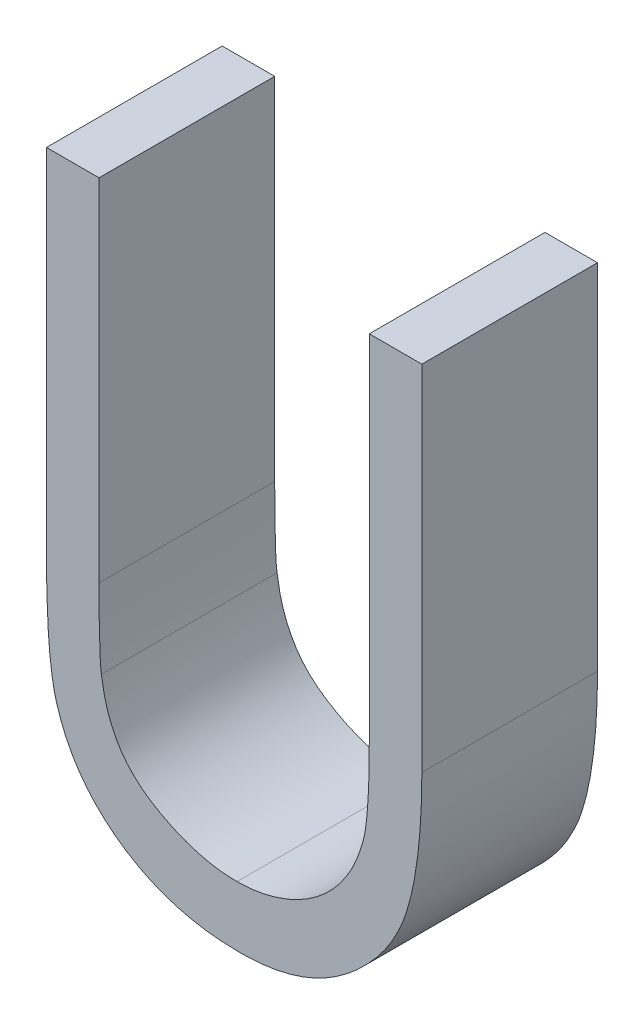
ISO-10303-21;
HEADER;
FILE_DESCRIPTION(('STEP AP214'),'2;1');
FILE_NAME('part.step','',(''),(''),'','','');
FILE_SCHEMA(('AUTOMOTIVE_DESIGN { 1 0 10303 214 1 1 1 1 }'));
ENDSEC;
DATA;
#1=APPLICATION_CONTEXT('core data for automotive mechanical design processes');
#2=APPLICATION_PROTOCOL_DEFINITION('international standard','automotive_design',2000,#1);
#3=PRODUCT_CONTEXT('',#1,'mechanical');
#4=PRODUCT('Part','Part','',(#3));
#5=PRODUCT_RELATED_PRODUCT_CATEGORY('part','',(#4));
#6=PRODUCT_DEFINITION_FORMATION('','',#4);
#7=PRODUCT_DEFINITION_CONTEXT('part definition',#1,'design');
#8=PRODUCT_DEFINITION('design','',#6,#7);
#9=PRODUCT_DEFINITION_SHAPE('','',#8);
#10=(LENGTH_UNIT() NAMED_UNIT(*) SI_UNIT(.MILLI.,.METRE.));
#11=(NAMED_UNIT(*) PLANE_ANGLE_UNIT() SI_UNIT($,.RADIAN.));
#12=(NAMED_UNIT(*) SI_UNIT($,.STERADIAN.) SOLID_ANGLE_UNIT());
#13=UNCERTAINTY_MEASURE_WITH_UNIT(LENGTH_MEASURE(1.E-05),#10,'distance_accuracy_value','');
#14=(GEOMETRIC_REPRESENTATION_CONTEXT(3) GLOBAL_UNCERTAINTY_ASSIGNED_CONTEXT((#13)) GLOBAL_UNIT_ASSIGNED_CONTEXT((#10,
#11,#12)) REPRESENTATION_CONTEXT('',''));
#15=CARTESIAN_POINT('',(0.,0.,0.));
#16=DIRECTION('',(0.,0.,1.));
#17=DIRECTION('',(1.,0.,0.));
#18=AXIS2_PLACEMENT_3D('',#15,#16,#17);
#19=CARTESIAN_POINT('',(-55.4324653258695,-20.8899508070001,1.5));
#20=DIRECTION('',(-1.,0.,0.));
#21=DIRECTION('',(0.,0.,1.));
#22=AXIS2_PLACEMENT_3D('',#19,#20,#21);
#23=PLANE('',#22);
#24=DIRECTION('',(0.,1.,0.));
#25=VECTOR('',#24,1.);
#26=CARTESIAN_POINT('',(-55.4324653258695,-20.8899508070001,0.));
#27=LINE('',#26,#25);
#28=CARTESIAN_POINT('',(-55.4324653258695,-20.8899508070001,0.));
#29=VERTEX_POINT('',#28);
#30=CARTESIAN_POINT('',(-55.4324653258695,-17.8701190762308,0.));
#31=VERTEX_POINT('',#30);
#32=EDGE_CURVE('E240',#29,#31,#27,.T.);
#33=ORIENTED_EDGE('',*,*,#32,.F.);
#34=DIRECTION('',(0.,0.,-1.));
#35=VECTOR('',#34,1.);
#36=CARTESIAN_POINT('',(-55.4324653258695,-20.8899508070001,1.5));
#37=LINE('',#36,#35);
#38=CARTESIAN_POINT('',(-55.4324653258695,-20.8899508070001,1.5));
#39=VERTEX_POINT('',#38);
#40=EDGE_CURVE('E11',#39,#29,#37,.T.);
#41=ORIENTED_EDGE('',*,*,#40,.F.);
#42=DIRECTION('',(0.,1.,0.));
#43=VECTOR('',#42,1.);
#44=CARTESIAN_POINT('',(-55.4324653258695,-20.8899508070001,1.5));
#45=LINE('',#44,#43);
#46=CARTESIAN_POINT('',(-55.4324653258695,-17.8701190762308,1.5));
#47=VERTEX_POINT('',#46);
#48=EDGE_CURVE('E266',#39,#47,#45,.T.);
#49=ORIENTED_EDGE('',*,*,#48,.T.);
#50=DIRECTION('',(0.,0.,-1.));
#51=VECTOR('',#50,1.);
#52=CARTESIAN_POINT('',(-55.4324653258695,-17.8701190762308,1.5));
#53=LINE('',#52,#51);
#54=EDGE_CURVE('E36',#47,#31,#53,.T.);
#55=ORIENTED_EDGE('',*,*,#54,.T.);
#56=EDGE_LOOP('',(#33,#41,#49,#55));
#57=FACE_BOUND('',#56,.T.);
#58=ADVANCED_FACE('F33',(#57),#23,.T.);
#59=CARTESIAN_POINT('',(-55.3433226976644,-21.9436367044359,1.5));
#60=CARTESIAN_POINT('',(-55.3507186379134,-21.917018740937,1.5));
#61=CARTESIAN_POINT('',(-55.3667605970227,-21.85928378532,1.5));
#62=CARTESIAN_POINT('',(-55.3839395936581,-21.7637316588094,1.5));
#63=CARTESIAN_POINT('',(-55.3983811388602,-21.6537103478804,1.5));
#64=CARTESIAN_POINT('',(-55.4119605077476,-21.5292123216403,1.5));
#65=CARTESIAN_POINT('',(-55.4199733048286,-21.3901410836367,1.5));
#66=CARTESIAN_POINT('',(-55.426998217252,-21.2365569181089,1.5));
#67=CARTESIAN_POINT('',(-55.4325148155328,-21.0682741157001,1.5));
#68=CARTESIAN_POINT('',(-55.4324822835277,-20.9510533791035,1.5));
#69=CARTESIAN_POINT('',(-55.4324653258695,-20.8899508070001,1.5));
#70=B_SPLINE_CURVE_WITH_KNOTS('',3,(#59,#60,#61,#62,#63,#64,#65,#66,#67,#68,#69),.UNSPECIFIED.,
.F.,.F.,(4,1,1,1,1,1,1,1,4),(0.,0.078129865158426,0.169465417497732,0.274335290854083,
0.392110163353921,0.523687329857518,0.66836542113896,0.827131902125782,1.),.UNSPECIFIED.);
#71=DIRECTION('',(0.,0.,-1.));
#72=VECTOR('',#71,1.);
#73=SURFACE_OF_LINEAR_EXTRUSION('',#70,#72);
#74=CARTESIAN_POINT('',(-55.3433226976644,-21.9436367044359,0.));
#75=CARTESIAN_POINT('',(-55.3507186379134,-21.917018740937,0.));
#76=CARTESIAN_POINT('',(-55.3667605970227,-21.85928378532,0.));
#77=CARTESIAN_POINT('',(-55.3839395936581,-21.7637316588094,0.));
#78=CARTESIAN_POINT('',(-55.3983811388602,-21.6537103478804,0.));
#79=CARTESIAN_POINT('',(-55.4119605077476,-21.5292123216403,0.));
#80=CARTESIAN_POINT('',(-55.4199733048286,-21.3901410836367,0.));
#81=CARTESIAN_POINT('',(-55.426998217252,-21.2365569181089,0.));
#82=CARTESIAN_POINT('',(-55.4325148155328,-21.0682741157001,0.));
#83=CARTESIAN_POINT('',(-55.4324822835277,-20.9510533791035,0.));
#84=CARTESIAN_POINT('',(-55.4324653258695,-20.8899508070001,0.));
#85=B_SPLINE_CURVE_WITH_KNOTS('',3,(#74,#75,#76,#77,#78,#79,#80,#81,#82,#83,#84),.UNSPECIFIED.,
.F.,.F.,(4,1,1,1,1,1,1,1,4),(0.,0.078129865158426,0.169465417497732,0.274335290854083,
0.392110163353921,0.523687329857518,0.66836542113896,0.827131902125782,1.),.UNSPECIFIED.);
#86=CARTESIAN_POINT('',(-55.3433226976644,-21.9436367044359,0.));
#87=VERTEX_POINT('',#86);
#88=EDGE_CURVE('E265',#87,#29,#85,.T.);
#89=ORIENTED_EDGE('',*,*,#88,.F.);
#90=DIRECTION('',(0.,0.,-1.));
#91=VECTOR('',#90,1.);
#92=CARTESIAN_POINT('',(-55.3433226976644,-21.9436367044359,1.5));
#93=LINE('',#92,#91);
#94=CARTESIAN_POINT('',(-55.3433226976644,-21.9436367044359,1.5));
#95=VERTEX_POINT('',#94);
#96=EDGE_CURVE('E42',#95,#87,#93,.T.);
#97=ORIENTED_EDGE('',*,*,#96,.F.);
#98=EDGE_CURVE('E150',#95,#39,#70,.T.);
#99=ORIENTED_EDGE('',*,*,#98,.T.);
#100=ORIENTED_EDGE('',*,*,#40,.T.);
#101=EDGE_LOOP('',(#89,#97,#99,#100));
#102=FACE_BOUND('',#101,.T.);
#103=ADVANCED_FACE('F245',(#102),#73,.T.);
#104=CARTESIAN_POINT('',(-53.7808226976644,-22.998324204436,1.5));
#105=CARTESIAN_POINT('',(-53.8289214156758,-22.9972031112015,1.5));
#106=CARTESIAN_POINT('',(-53.9232909283602,-22.9950035302857,1.5));
#107=CARTESIAN_POINT('',(-54.0623453101884,-22.9823996015315,1.5));
#108=CARTESIAN_POINT('',(-54.1956513049014,-22.958659038224,1.5));
#109=CARTESIAN_POINT('',(-54.3246168435084,-22.9284305471911,1.5));
#110=CARTESIAN_POINT('',(-54.4474861251298,-22.8867394939362,1.5));
#111=CARTESIAN_POINT('',(-54.5659053313895,-22.8380278869931,1.5));
#112=CARTESIAN_POINT('',(-54.6778463044164,-22.778203229446,1.5));
#113=CARTESIAN_POINT('',(-54.7851250595812,-22.7116412394177,1.5));
#114=CARTESIAN_POINT('',(-54.884874711233,-22.6367488991767,1.5));
#115=CARTESIAN_POINT('',(-54.9764424299582,-22.5551200792471,1.5));
#116=CARTESIAN_POINT('',(-55.0599793879459,-22.4680623972537,1.5));
#117=CARTESIAN_POINT('',(-55.134077525586,-22.3746333032989,1.5));
#118=CARTESIAN_POINT('',(-55.1999645035579,-22.2755594361505,1.5));
#119=CARTESIAN_POINT('',(-55.2567219512767,-22.1705605221374,1.5));
#120=CARTESIAN_POINT('',(-55.3054551571626,-22.0596772133455,1.5));
#121=CARTESIAN_POINT('',(-55.3306073958167,-21.9826012127667,1.5));
#122=CARTESIAN_POINT('',(-55.3433226976644,-21.9436367044359,1.5));
#123=B_SPLINE_CURVE_WITH_KNOTS('',3,(#104,#105,#106,#107,#108,#109,#110,#111,#112,#113,#114,
#115,#116,#117,#118,#119,#120,#121,#122),.UNSPECIFIED.,.F.,.F.,(4,1,1,1,1,1,1,1,1,1,1,1,1,1,1,1,
4),(0.,0.0711745037456321,0.139644121750624,0.206317223911961,0.271373240191883,
0.33541808391631,0.398076344652861,0.460607914632284,0.522969511117233,0.584715724092458,
0.644894940316361,0.70429056082079,0.76299818991932,0.821087430903877,0.8801038914767,
0.939388488189669,1.),.UNSPECIFIED.);
#124=DIRECTION('',(0.,0.,-1.));
#125=VECTOR('',#124,1.);
#126=SURFACE_OF_LINEAR_EXTRUSION('',#123,#125);
#127=CARTESIAN_POINT('',(-53.7808226976644,-22.998324204436,0.));
#128=CARTESIAN_POINT('',(-53.8289214156758,-22.9972031112015,0.));
#129=CARTESIAN_POINT('',(-53.9232909283602,-22.9950035302857,0.));
#130=CARTESIAN_POINT('',(-54.0623453101884,-22.9823996015315,0.));
#131=CARTESIAN_POINT('',(-54.1956513049014,-22.958659038224,0.));
#132=CARTESIAN_POINT('',(-54.3246168435084,-22.9284305471911,0.));
#133=CARTESIAN_POINT('',(-54.4474861251298,-22.8867394939362,0.));
#134=CARTESIAN_POINT('',(-54.5659053313895,-22.8380278869931,0.));
#135=CARTESIAN_POINT('',(-54.6778463044164,-22.778203229446,0.));
#136=CARTESIAN_POINT('',(-54.7851250595812,-22.7116412394177,0.));
#137=CARTESIAN_POINT('',(-54.884874711233,-22.6367488991767,0.));
#138=CARTESIAN_POINT('',(-54.9764424299582,-22.5551200792471,0.));
#139=CARTESIAN_POINT('',(-55.0599793879459,-22.4680623972537,0.));
#140=CARTESIAN_POINT('',(-55.134077525586,-22.3746333032989,0.));
#141=CARTESIAN_POINT('',(-55.1999645035579,-22.2755594361505,0.));
#142=CARTESIAN_POINT('',(-55.2567219512767,-22.1705605221374,0.));
#143=CARTESIAN_POINT('',(-55.3054551571626,-22.0596772133455,0.));
#144=CARTESIAN_POINT('',(-55.3306073958167,-21.9826012127667,0.));
#145=CARTESIAN_POINT('',(-55.3433226976644,-21.9436367044359,0.));
#146=B_SPLINE_CURVE_WITH_KNOTS('',3,(#127,#128,#129,#130,#131,#132,#133,#134,#135,#136,#137,
#138,#139,#140,#141,#142,#143,#144,#145),.UNSPECIFIED.,.F.,.F.,(4,1,1,1,1,1,1,1,1,1,1,1,1,1,1,1,
4),(0.,0.0711745037456321,0.139644121750624,0.206317223911961,0.271373240191883,
0.33541808391631,0.398076344652861,0.460607914632284,0.522969511117233,0.584715724092458,
0.644894940316361,0.70429056082079,0.76299818991932,0.821087430903877,0.8801038914767,
0.939388488189669,1.),.UNSPECIFIED.);
#147=CARTESIAN_POINT('',(-53.7808226976644,-22.998324204436,0.));
#148=VERTEX_POINT('',#147);
#149=EDGE_CURVE('E137',#148,#87,#146,.T.);
#150=ORIENTED_EDGE('',*,*,#149,.F.);
#151=DIRECTION('',(0.,0.,-1.));
#152=VECTOR('',#151,1.);
#153=CARTESIAN_POINT('',(-53.7808226976644,-22.998324204436,1.5));
#154=LINE('',#153,#152);
#155=CARTESIAN_POINT('',(-53.7808226976644,-22.998324204436,1.5));
#156=VERTEX_POINT('',#155);
#157=EDGE_CURVE('E132',#156,#148,#154,.T.);
#158=ORIENTED_EDGE('',*,*,#157,.F.);
#159=EDGE_CURVE('E135',#156,#95,#123,.T.);
#160=ORIENTED_EDGE('',*,*,#159,.T.);
#161=ORIENTED_EDGE('',*,*,#96,.T.);
#162=EDGE_LOOP('',(#150,#158,#160,#161));
#163=FACE_BOUND('',#162,.T.);
#164=ADVANCED_FACE('F134',(#163),#126,.T.);
#165=CARTESIAN_POINT('',(-52.2273371207413,-20.8899508070001,1.5));
#166=CARTESIAN_POINT('',(-52.227700149862,-20.9443770626411,1.5));
#167=CARTESIAN_POINT('',(-52.2284086232633,-21.0505932096439,1.5));
#168=CARTESIAN_POINT('',(-52.2345523039735,-21.2062380082496,1.5));
#169=CARTESIAN_POINT('',(-52.244348018048,-21.3538851244023,1.5));
#170=CARTESIAN_POINT('',(-52.2581881437253,-21.4935544051561,1.5));
#171=CARTESIAN_POINT('',(-52.2765267196826,-21.6247460612183,1.5));
#172=CARTESIAN_POINT('',(-52.2969198918321,-21.7486100157546,1.5));
#173=CARTESIAN_POINT('',(-52.3228906533421,-21.8642571481074,1.5));
#174=CARTESIAN_POINT('',(-52.3532240836038,-21.9725891733153,1.5));
#175=CARTESIAN_POINT('',(-52.3879005807993,-22.0757113353351,1.5));
#176=CARTESIAN_POINT('',(-52.4328165070005,-22.173580784855,1.5));
#177=CARTESIAN_POINT('',(-52.483422935476,-22.2691727843266,1.5));
#178=CARTESIAN_POINT('',(-52.5434438682071,-22.3610415113008,1.5));
#179=CARTESIAN_POINT('',(-52.6108887005539,-22.4495937300687,1.5));
#180=CARTESIAN_POINT('',(-52.6872482444786,-22.5342924086541,1.5));
#181=CARTESIAN_POINT('',(-52.7699970457556,-22.6164910461892,1.5));
#182=CARTESIAN_POINT('',(-52.8605107023237,-22.6940811406932,1.5));
#183=CARTESIAN_POINT('',(-52.9572971669761,-22.7652363933898,1.5));
#184=CARTESIAN_POINT('',(-53.0600685350592,-22.8278046377952,1.5));
#185=CARTESIAN_POINT('',(-53.1680353489914,-22.880695519911,1.5));
#186=CARTESIAN_POINT('',(-53.2809169577404,-22.9242325547698,1.5));
#187=CARTESIAN_POINT('',(-53.3987615332966,-22.9569676964807,1.5));
#188=CARTESIAN_POINT('',(-53.5215720471881,-22.9813607761678,1.5));
#189=CARTESIAN_POINT('',(-53.6496280376375,-22.9952212012244,1.5));
#190=CARTESIAN_POINT('',(-53.7367204036347,-22.9972811013098,1.5));
#191=CARTESIAN_POINT('',(-53.7808226976644,-22.998324204436,1.5));
#192=B_SPLINE_CURVE_WITH_KNOTS('',3,(#165,#166,#167,#168,#169,#170,#171,#172,#173,#174,#175,
#176,#177,#178,#179,#180,#181,#182,#183,#184,#185,#186,#187,#188,#189,#190,#191),.UNSPECIFIED.,
.F.,.F.,(4,1,1,1,1,1,1,1,1,1,1,1,1,1,1,1,1,1,1,1,1,1,1,1,4),(0.,0.0548580354451544,
0.107058791542641,0.156978354576524,0.203992277182977,0.248491535786849,0.290483313740523,
0.330489004298189,0.367885925762963,0.403858131353871,0.440009343307411,0.476295010779684,
0.512792294573348,0.550484824630372,0.588381115774843,0.627645327169853,0.667979464454381,
0.708432757500082,0.748602302288633,0.78908777719578,0.829461204631705,0.870371045305179,
0.912214227149443,0.955546574931686,1.),.UNSPECIFIED.);
#193=DIRECTION('',(0.,0.,-1.));
#194=VECTOR('',#193,1.);
#195=SURFACE_OF_LINEAR_EXTRUSION('',#192,#194);
#196=CARTESIAN_POINT('',(-52.2273371207413,-20.8899508070001,0.));
#197=CARTESIAN_POINT('',(-52.227700149862,-20.9443770626411,0.));
#198=CARTESIAN_POINT('',(-52.2284086232633,-21.0505932096439,0.));
#199=CARTESIAN_POINT('',(-52.2345523039735,-21.2062380082496,0.));
#200=CARTESIAN_POINT('',(-52.244348018048,-21.3538851244023,0.));
#201=CARTESIAN_POINT('',(-52.2581881437253,-21.4935544051561,0.));
#202=CARTESIAN_POINT('',(-52.2765267196826,-21.6247460612183,0.));
#203=CARTESIAN_POINT('',(-52.2969198918321,-21.7486100157546,0.));
#204=CARTESIAN_POINT('',(-52.3228906533421,-21.8642571481074,0.));
#205=CARTESIAN_POINT('',(-52.3532240836038,-21.9725891733153,0.));
#206=CARTESIAN_POINT('',(-52.3879005807993,-22.0757113353351,0.));
#207=CARTESIAN_POINT('',(-52.4328165070005,-22.173580784855,0.));
#208=CARTESIAN_POINT('',(-52.483422935476,-22.2691727843266,0.));
#209=CARTESIAN_POINT('',(-52.5434438682071,-22.3610415113008,0.));
#210=CARTESIAN_POINT('',(-52.6108887005539,-22.4495937300687,0.));
#211=CARTESIAN_POINT('',(-52.6872482444786,-22.5342924086541,0.));
#212=CARTESIAN_POINT('',(-52.7699970457556,-22.6164910461892,0.));
#213=CARTESIAN_POINT('',(-52.8605107023237,-22.6940811406932,0.));
#214=CARTESIAN_POINT('',(-52.9572971669761,-22.7652363933898,0.));
#215=CARTESIAN_POINT('',(-53.0600685350592,-22.8278046377952,0.));
#216=CARTESIAN_POINT('',(-53.1680353489914,-22.880695519911,0.));
#217=CARTESIAN_POINT('',(-53.2809169577404,-22.9242325547698,0.));
#218=CARTESIAN_POINT('',(-53.3987615332966,-22.9569676964807,0.));
#219=CARTESIAN_POINT('',(-53.5215720471881,-22.9813607761678,0.));
#220=CARTESIAN_POINT('',(-53.6496280376375,-22.9952212012244,0.));
#221=CARTESIAN_POINT('',(-53.7367204036347,-22.9972811013098,0.));
#222=CARTESIAN_POINT('',(-53.7808226976644,-22.998324204436,0.));
#223=B_SPLINE_CURVE_WITH_KNOTS('',3,(#196,#197,#198,#199,#200,#201,#202,#203,#204,#205,#206,
#207,#208,#209,#210,#211,#212,#213,#214,#215,#216,#217,#218,#219,#220,#221,#222),.UNSPECIFIED.,
.F.,.F.,(4,1,1,1,1,1,1,1,1,1,1,1,1,1,1,1,1,1,1,1,1,1,1,1,4),(0.,0.0548580354451544,
0.107058791542641,0.156978354576524,0.203992277182977,0.248491535786849,0.290483313740523,
0.330489004298189,0.367885925762963,0.403858131353871,0.440009343307411,0.476295010779684,
0.512792294573348,0.550484824630372,0.588381115774843,0.627645327169853,0.667979464454381,
0.708432757500082,0.748602302288633,0.78908777719578,0.829461204631705,0.870371045305179,
0.912214227149443,0.955546574931686,1.),.UNSPECIFIED.);
#224=CARTESIAN_POINT('',(-52.2273371207413,-20.8899508070001,0.));
#225=VERTEX_POINT('',#224);
#226=EDGE_CURVE('E270',#225,#148,#223,.T.);
#227=ORIENTED_EDGE('',*,*,#226,.F.);
#228=DIRECTION('',(0.,0.,-1.));
#229=VECTOR('',#228,1.);
#230=CARTESIAN_POINT('',(-52.2273371207413,-20.8899508070001,1.5));
#231=LINE('',#230,#229);
#232=CARTESIAN_POINT('',(-52.2273371207413,-20.8899508070001,1.5));
#233=VERTEX_POINT('',#232);
#234=EDGE_CURVE('E142',#233,#225,#231,.T.);
#235=ORIENTED_EDGE('',*,*,#234,.F.);
#236=EDGE_CURVE('E148',#233,#156,#192,.T.);
#237=ORIENTED_EDGE('',*,*,#236,.T.);
#238=ORIENTED_EDGE('',*,*,#157,.T.);
#239=EDGE_LOOP('',(#227,#235,#237,#238));
#240=FACE_BOUND('',#239,.T.);
#241=ADVANCED_FACE('F152',(#240),#195,.T.);
#242=CARTESIAN_POINT('',(-52.2273371207413,-17.8701190762308,1.5));
#243=DIRECTION('',(1.,0.,0.));
#244=DIRECTION('',(0.,0.,-1.));
#245=AXIS2_PLACEMENT_3D('',#242,#243,#244);
#246=PLANE('',#245);
#247=DIRECTION('',(0.,-1.,0.));
#248=VECTOR('',#247,1.);
#249=CARTESIAN_POINT('',(-52.2273371207413,-17.8701190762308,0.));
#250=LINE('',#249,#248);
#251=CARTESIAN_POINT('',(-52.2273371207413,-17.8701190762308,0.));
#252=VERTEX_POINT('',#251);
#253=EDGE_CURVE('E283',#252,#225,#250,.T.);
#254=ORIENTED_EDGE('',*,*,#253,.F.);
#255=DIRECTION('',(0.,0.,-1.));
#256=VECTOR('',#255,1.);
#257=CARTESIAN_POINT('',(-52.2273371207413,-17.8701190762308,1.5));
#258=LINE('',#257,#256);
#259=CARTESIAN_POINT('',(-52.2273371207413,-17.8701190762308,1.5));
#260=VERTEX_POINT('',#259);
#261=EDGE_CURVE('E212',#260,#252,#258,.T.);
#262=ORIENTED_EDGE('',*,*,#261,.F.);
#263=DIRECTION('',(0.,-1.,0.));
#264=VECTOR('',#263,1.);
#265=CARTESIAN_POINT('',(-52.2273371207413,-17.8701190762308,1.5));
#266=LINE('',#265,#264);
#267=EDGE_CURVE('E153',#260,#233,#266,.T.);
#268=ORIENTED_EDGE('',*,*,#267,.T.);
#269=ORIENTED_EDGE('',*,*,#234,.T.);
#270=EDGE_LOOP('',(#254,#262,#268,#269));
#271=FACE_BOUND('',#270,.T.);
#272=ADVANCED_FACE('F172',(#271),#246,.T.);
#273=CARTESIAN_POINT('',(-52.6760550694593,-17.8701190762308,1.5));
#274=DIRECTION('',(0.,1.,0.));
#275=DIRECTION('',(0.,0.,1.));
#276=AXIS2_PLACEMENT_3D('',#273,#274,#275);
#277=PLANE('',#276);
#278=DIRECTION('',(1.,0.,0.));
#279=VECTOR('',#278,1.);
#280=CARTESIAN_POINT('',(-52.6760550694593,-17.8701190762308,0.));
#281=LINE('',#280,#279);
#282=CARTESIAN_POINT('',(-52.6760550694593,-17.8701190762308,0.));
#283=VERTEX_POINT('',#282);
#284=EDGE_CURVE('E285',#283,#252,#281,.T.);
#285=ORIENTED_EDGE('',*,*,#284,.F.);
#286=DIRECTION('',(0.,0.,-1.));
#287=VECTOR('',#286,1.);
#288=CARTESIAN_POINT('',(-52.6760550694593,-17.8701190762308,1.5));
#289=LINE('',#288,#287);
#290=CARTESIAN_POINT('',(-52.6760550694593,-17.8701190762308,1.5));
#291=VERTEX_POINT('',#290);
#292=EDGE_CURVE('E214',#291,#283,#289,.T.);
#293=ORIENTED_EDGE('',*,*,#292,.F.);
#294=DIRECTION('',(1.,0.,0.));
#295=VECTOR('',#294,1.);
#296=CARTESIAN_POINT('',(-52.6760550694593,-17.8701190762308,1.5));
#297=LINE('',#296,#295);
#298=EDGE_CURVE('E155',#291,#260,#297,.T.);
#299=ORIENTED_EDGE('',*,*,#298,.T.);
#300=ORIENTED_EDGE('',*,*,#261,.T.);
#301=EDGE_LOOP('',(#285,#293,#299,#300));
#302=FACE_BOUND('',#301,.T.);
#303=ADVANCED_FACE('F176',(#302),#277,.T.);
#304=CARTESIAN_POINT('',(-52.6760550694593,-20.8659123454616,1.5));
#305=DIRECTION('',(-1.,0.,0.));
#306=DIRECTION('',(0.,0.,1.));
#307=AXIS2_PLACEMENT_3D('',#304,#305,#306);
#308=PLANE('',#307);
#309=DIRECTION('',(0.,1.,0.));
#310=VECTOR('',#309,1.);
#311=CARTESIAN_POINT('',(-52.6760550694593,-20.8659123454616,0.));
#312=LINE('',#311,#310);
#313=CARTESIAN_POINT('',(-52.6760550694593,-20.8659123454616,0.));
#314=VERTEX_POINT('',#313);
#315=EDGE_CURVE('E220',#314,#283,#312,.T.);
#316=ORIENTED_EDGE('',*,*,#315,.F.);
#317=DIRECTION('',(0.,0.,-1.));
#318=VECTOR('',#317,1.);
#319=CARTESIAN_POINT('',(-52.6760550694593,-20.8659123454616,1.5));
#320=LINE('',#319,#318);
#321=CARTESIAN_POINT('',(-52.6760550694593,-20.8659123454616,1.5));
#322=VERTEX_POINT('',#321);
#323=EDGE_CURVE('E218',#322,#314,#320,.T.);
#324=ORIENTED_EDGE('',*,*,#323,.F.);
#325=DIRECTION('',(0.,1.,0.));
#326=VECTOR('',#325,1.);
#327=CARTESIAN_POINT('',(-52.6760550694593,-20.8659123454616,1.5));
#328=LINE('',#327,#326);
#329=EDGE_CURVE('E199',#322,#291,#328,.T.);
#330=ORIENTED_EDGE('',*,*,#329,.T.);
#331=ORIENTED_EDGE('',*,*,#292,.T.);
#332=EDGE_LOOP('',(#316,#324,#330,#331));
#333=FACE_BOUND('',#332,.T.);
#334=ADVANCED_FACE('F180',(#333),#308,.T.);
#335=CARTESIAN_POINT('',(-52.7271368002285,-21.6421543326411,1.5));
#336=CARTESIAN_POINT('',(-52.7228509069499,-21.6245135121515,1.5));
#337=CARTESIAN_POINT('',(-52.7133002095199,-21.58520265489,1.5));
#338=CARTESIAN_POINT('',(-52.7043758595398,-21.5187436683835,1.5));
#339=CARTESIAN_POINT('',(-52.6950808232317,-21.440330291288,1.5));
#340=CARTESIAN_POINT('',(-52.6886314375161,-21.3493991301302,1.5));
#341=CARTESIAN_POINT('',(-52.6823439797813,-21.2462548835526,1.5));
#342=CARTESIAN_POINT('',(-52.678582447215,-21.1303602300048,1.5));
#343=CARTESIAN_POINT('',(-52.6768438287519,-21.0021360002746,1.5));
#344=CARTESIAN_POINT('',(-52.6763257139598,-20.912654340595,1.5));
#345=CARTESIAN_POINT('',(-52.6760550694593,-20.8659123454616,1.5));
#346=B_SPLINE_CURVE_WITH_KNOTS('',3,(#335,#336,#337,#338,#339,#340,#341,#342,#343,#344,#345),
.UNSPECIFIED.,.F.,.F.,(4,1,1,1,1,1,1,1,4),(0.,0.0698351039154373,0.155620754911662,
0.257801556658276,0.373811234066372,0.506402492674369,0.655564458143102,0.820079282403853,1.),.UNSPECIFIED.);
#347=DIRECTION('',(0.,0.,-1.));
#348=VECTOR('',#347,1.);
#349=SURFACE_OF_LINEAR_EXTRUSION('',#346,#348);
#350=CARTESIAN_POINT('',(-52.7271368002285,-21.6421543326411,0.));
#351=CARTESIAN_POINT('',(-52.7228509069499,-21.6245135121515,0.));
#352=CARTESIAN_POINT('',(-52.7133002095199,-21.58520265489,0.));
#353=CARTESIAN_POINT('',(-52.7043758595398,-21.5187436683835,0.));
#354=CARTESIAN_POINT('',(-52.6950808232317,-21.440330291288,0.));
#355=CARTESIAN_POINT('',(-52.6886314375161,-21.3493991301302,0.));
#356=CARTESIAN_POINT('',(-52.6823439797813,-21.2462548835526,0.));
#357=CARTESIAN_POINT('',(-52.678582447215,-21.1303602300048,0.));
#358=CARTESIAN_POINT('',(-52.6768438287519,-21.0021360002746,0.));
#359=CARTESIAN_POINT('',(-52.6763257139598,-20.912654340595,0.));
#360=CARTESIAN_POINT('',(-52.6760550694593,-20.8659123454616,0.));
#361=B_SPLINE_CURVE_WITH_KNOTS('',3,(#350,#351,#352,#353,#354,#355,#356,#357,#358,#359,#360),
.UNSPECIFIED.,.F.,.F.,(4,1,1,1,1,1,1,1,4),(0.,0.0698351039154373,0.155620754911662,
0.257801556658276,0.373811234066372,0.506402492674369,0.655564458143102,0.820079282403853,1.),.UNSPECIFIED.);
#362=CARTESIAN_POINT('',(-52.7271368002285,-21.6421543326411,0.));
#363=VERTEX_POINT('',#362);
#364=EDGE_CURVE('E295',#363,#314,#361,.T.);
#365=ORIENTED_EDGE('',*,*,#364,.F.);
#366=DIRECTION('',(0.,0.,-1.));
#367=VECTOR('',#366,1.);
#368=CARTESIAN_POINT('',(-52.7271368002285,-21.6421543326411,1.5));
#369=LINE('',#368,#367);
#370=CARTESIAN_POINT('',(-52.7271368002285,-21.6421543326411,1.5));
#371=VERTEX_POINT('',#370);
#372=EDGE_CURVE('E223',#371,#363,#369,.T.);
#373=ORIENTED_EDGE('',*,*,#372,.F.);
#374=EDGE_CURVE('E193',#371,#322,#346,.T.);
#375=ORIENTED_EDGE('',*,*,#374,.T.);
#376=ORIENTED_EDGE('',*,*,#323,.T.);
#377=EDGE_LOOP('',(#365,#373,#375,#376));
#378=FACE_BOUND('',#377,.T.);
#379=ADVANCED_FACE('F184',(#378),#349,.T.);
#380=CARTESIAN_POINT('',(-53.805862761767,-22.4855036916154,1.5));
#381=CARTESIAN_POINT('',(-53.7650717040632,-22.4839696197845,1.5));
#382=CARTESIAN_POINT('',(-53.6837251870643,-22.4809103365177,1.5));
#383=CARTESIAN_POINT('',(-53.5628588575088,-22.461965435047,1.5));
#384=CARTESIAN_POINT('',(-53.4451444165798,-22.4278217697889,1.5));
#385=CARTESIAN_POINT('',(-53.3300005881408,-22.3837649720479,1.5));
#386=CARTESIAN_POINT('',(-53.2220706103985,-22.3255541276263,1.5));
#387=CARTESIAN_POINT('',(-53.1212942646678,-22.2583100712373,1.5));
#388=CARTESIAN_POINT('',(-53.0313457871986,-22.1794373912119,1.5));
#389=CARTESIAN_POINT('',(-52.9492629331528,-22.0921511847393,1.5));
#390=CARTESIAN_POINT('',(-52.8777844533633,-21.9936657562147,1.5));
#391=CARTESIAN_POINT('',(-52.8158256796466,-21.8861255590021,1.5));
#392=CARTESIAN_POINT('',(-52.7650743515816,-21.7679122063126,1.5));
#393=CARTESIAN_POINT('',(-52.7400121732395,-21.6848344602413,1.5));
#394=CARTESIAN_POINT('',(-52.7271368002285,-21.6421543326411,1.5));
#395=B_SPLINE_CURVE_WITH_KNOTS('',3,(#380,#381,#382,#383,#384,#385,#386,#387,#388,#389,#390,
#391,#392,#393,#394),.UNSPECIFIED.,.F.,.F.,(4,1,1,1,1,1,1,1,1,1,1,1,4),(0.,0.0828906475568688,
0.165302540559471,0.247761876114588,0.331527711059801,0.415279812775155,0.49636623048405,
0.577151348021145,0.65778254013888,0.739321641994346,0.823793081666316,0.909475953379114,1.),.UNSPECIFIED.);
#396=DIRECTION('',(0.,0.,-1.));
#397=VECTOR('',#396,1.);
#398=SURFACE_OF_LINEAR_EXTRUSION('',#395,#397);
#399=CARTESIAN_POINT('',(-53.805862761767,-22.4855036916154,0.));
#400=CARTESIAN_POINT('',(-53.7650717040632,-22.4839696197845,0.));
#401=CARTESIAN_POINT('',(-53.6837251870643,-22.4809103365177,0.));
#402=CARTESIAN_POINT('',(-53.5628588575088,-22.461965435047,0.));
#403=CARTESIAN_POINT('',(-53.4451444165798,-22.4278217697889,0.));
#404=CARTESIAN_POINT('',(-53.3300005881408,-22.3837649720479,0.));
#405=CARTESIAN_POINT('',(-53.2220706103985,-22.3255541276263,0.));
#406=CARTESIAN_POINT('',(-53.1212942646678,-22.2583100712373,0.));
#407=CARTESIAN_POINT('',(-53.0313457871986,-22.1794373912119,0.));
#408=CARTESIAN_POINT('',(-52.9492629331528,-22.0921511847393,0.));
#409=CARTESIAN_POINT('',(-52.8777844533633,-21.9936657562147,0.));
#410=CARTESIAN_POINT('',(-52.8158256796466,-21.8861255590021,0.));
#411=CARTESIAN_POINT('',(-52.7650743515816,-21.7679122063126,0.));
#412=CARTESIAN_POINT('',(-52.7400121732395,-21.6848344602413,0.));
#413=CARTESIAN_POINT('',(-52.7271368002285,-21.6421543326411,0.));
#414=B_SPLINE_CURVE_WITH_KNOTS('',3,(#399,#400,#401,#402,#403,#404,#405,#406,#407,#408,#409,
#410,#411,#412,#413),.UNSPECIFIED.,.F.,.F.,(4,1,1,1,1,1,1,1,1,1,1,1,4),(0.,0.0828906475568688,
0.165302540559471,0.247761876114588,0.331527711059801,0.415279812775155,0.49636623048405,
0.577151348021145,0.65778254013888,0.739321641994346,0.823793081666316,0.909475953379114,1.),.UNSPECIFIED.);
#415=CARTESIAN_POINT('',(-53.805862761767,-22.4855036916154,0.));
#416=VERTEX_POINT('',#415);
#417=EDGE_CURVE('E299',#416,#363,#414,.T.);
#418=ORIENTED_EDGE('',*,*,#417,.F.);
#419=DIRECTION('',(0.,0.,-1.));
#420=VECTOR('',#419,1.);
#421=CARTESIAN_POINT('',(-53.805862761767,-22.4855036916154,1.5));
#422=LINE('',#421,#420);
#423=CARTESIAN_POINT('',(-53.805862761767,-22.4855036916154,1.5));
#424=VERTEX_POINT('',#423);
#425=EDGE_CURVE('E226',#424,#416,#422,.T.);
#426=ORIENTED_EDGE('',*,*,#425,.F.);
#427=EDGE_CURVE('E200',#424,#371,#395,.T.);
#428=ORIENTED_EDGE('',*,*,#427,.T.);
#429=ORIENTED_EDGE('',*,*,#372,.T.);
#430=EDGE_LOOP('',(#418,#426,#428,#429));
#431=FACE_BOUND('',#430,.T.);
#432=ADVANCED_FACE('F189',(#431),#398,.T.);
#433=CARTESIAN_POINT('',(-54.9637153258695,-21.5309764480257,1.5));
#434=CARTESIAN_POINT('',(-54.9563189561477,-21.5779003956707,1.5));
#435=CARTESIAN_POINT('',(-54.9419429756684,-21.6691042944387,1.5));
#436=CARTESIAN_POINT('',(-54.905305293131,-21.7989732685032,1.5));
#437=CARTESIAN_POINT('',(-54.8541374345579,-21.9160182088991,1.5));
#438=CARTESIAN_POINT('',(-54.7935045163777,-22.0238914819162,1.5));
#439=CARTESIAN_POINT('',(-54.7136007858771,-22.1195905676943,1.5));
#440=CARTESIAN_POINT('',(-54.6178814497675,-22.2077500716827,1.5));
#441=CARTESIAN_POINT('',(-54.5019132090089,-22.2848526497427,1.5));
#442=CARTESIAN_POINT('',(-54.3729694866185,-22.355353809487,1.5));
#443=CARTESIAN_POINT('',(-54.2339905758828,-22.412018212868,1.5));
#444=CARTESIAN_POINT('',(-54.0919744810954,-22.4548658762114,1.5));
#445=CARTESIAN_POINT('',(-53.9490559394452,-22.4809785901737,1.5));
#446=CARTESIAN_POINT('',(-53.8533757036156,-22.4840022172774,1.5));
#447=CARTESIAN_POINT('',(-53.805862761767,-22.4855036916154,1.5));
#448=B_SPLINE_CURVE_WITH_KNOTS('',3,(#433,#434,#435,#436,#437,#438,#439,#440,#441,#442,#443,
#444,#445,#446,#447),.UNSPECIFIED.,.F.,.F.,(4,1,1,1,1,1,1,1,1,1,1,1,4),(0.,0.086315003740591,
0.16776646591794,0.244432684384859,0.318134662351454,0.391884106979963,0.470068050391753,
0.553904178713909,0.644339498309819,0.736874663334509,0.826168364307645,0.91367859488958,1.),.UNSPECIFIED.);
#449=DIRECTION('',(0.,0.,-1.));
#450=VECTOR('',#449,1.);
#451=SURFACE_OF_LINEAR_EXTRUSION('',#448,#450);
#452=CARTESIAN_POINT('',(-54.9637153258695,-21.5309764480257,0.));
#453=CARTESIAN_POINT('',(-54.9563189561477,-21.5779003956707,0.));
#454=CARTESIAN_POINT('',(-54.9419429756684,-21.6691042944387,0.));
#455=CARTESIAN_POINT('',(-54.905305293131,-21.7989732685032,0.));
#456=CARTESIAN_POINT('',(-54.8541374345579,-21.9160182088991,0.));
#457=CARTESIAN_POINT('',(-54.7935045163777,-22.0238914819162,0.));
#458=CARTESIAN_POINT('',(-54.7136007858771,-22.1195905676943,0.));
#459=CARTESIAN_POINT('',(-54.6178814497675,-22.2077500716827,0.));
#460=CARTESIAN_POINT('',(-54.5019132090089,-22.2848526497427,0.));
#461=CARTESIAN_POINT('',(-54.3729694866185,-22.355353809487,0.));
#462=CARTESIAN_POINT('',(-54.2339905758828,-22.412018212868,0.));
#463=CARTESIAN_POINT('',(-54.0919744810954,-22.4548658762114,0.));
#464=CARTESIAN_POINT('',(-53.9490559394452,-22.4809785901737,0.));
#465=CARTESIAN_POINT('',(-53.8533757036156,-22.4840022172774,0.));
#466=CARTESIAN_POINT('',(-53.805862761767,-22.4855036916154,0.));
#467=B_SPLINE_CURVE_WITH_KNOTS('',3,(#452,#453,#454,#455,#456,#457,#458,#459,#460,#461,#462,
#463,#464,#465,#466),.UNSPECIFIED.,.F.,.F.,(4,1,1,1,1,1,1,1,1,1,1,1,4),(0.,0.086315003740591,
0.16776646591794,0.244432684384859,0.318134662351454,0.391884106979963,0.470068050391753,
0.553904178713909,0.644339498309819,0.736874663334509,0.826168364307645,0.91367859488958,1.),.UNSPECIFIED.);
#468=CARTESIAN_POINT('',(-54.9637153258695,-21.5309764480257,0.));
#469=VERTEX_POINT('',#468);
#470=EDGE_CURVE('E307',#469,#416,#467,.T.);
#471=ORIENTED_EDGE('',*,*,#470,.F.);
#472=DIRECTION('',(0.,0.,-1.));
#473=VECTOR('',#472,1.);
#474=CARTESIAN_POINT('',(-54.9637153258695,-21.5309764480257,1.5));
#475=LINE('',#474,#473);
#476=CARTESIAN_POINT('',(-54.9637153258695,-21.5309764480257,1.5));
#477=VERTEX_POINT('',#476);
#478=EDGE_CURVE('E231',#477,#469,#475,.T.);
#479=ORIENTED_EDGE('',*,*,#478,.F.);
#480=EDGE_CURVE('E347',#477,#424,#448,.T.);
#481=ORIENTED_EDGE('',*,*,#480,.T.);
#482=ORIENTED_EDGE('',*,*,#425,.T.);
#483=EDGE_LOOP('',(#471,#479,#481,#482));
#484=FACE_BOUND('',#483,.T.);
#485=ADVANCED_FACE('F342',(#484),#451,.T.);
#486=CARTESIAN_POINT('',(-54.9837473771516,-20.8659123454616,1.5));
#487=CARTESIAN_POINT('',(-54.9838141542555,-20.9083133965255,1.5));
#488=CARTESIAN_POINT('',(-54.9839408753179,-20.9887766978825,1.5));
#489=CARTESIAN_POINT('',(-54.9830944269302,-21.1033028414964,1.5));
#490=CARTESIAN_POINT('',(-54.9807239006255,-21.2051206401417,1.5));
#491=CARTESIAN_POINT('',(-54.9792293869709,-21.2946225652392,1.5));
#492=CARTESIAN_POINT('',(-54.9759046247778,-21.3713979187518,1.5));
#493=CARTESIAN_POINT('',(-54.9731931292064,-21.4358626483002,1.5));
#494=CARTESIAN_POINT('',(-54.9697066196224,-21.4877115089495,1.5));
#495=CARTESIAN_POINT('',(-54.9655164517657,-21.5179699747365,1.5));
#496=CARTESIAN_POINT('',(-54.9637153258695,-21.5309764480257,1.5));
#497=B_SPLINE_CURVE_WITH_KNOTS('',3,(#486,#487,#488,#489,#490,#491,#492,#493,#494,#495,#496),
.UNSPECIFIED.,.F.,.F.,(4,1,1,1,1,1,1,1,4),(0.,0.191078591715722,0.362604556309971,
0.51609875027856,0.650038026039839,0.765976720986792,0.862374025799388,0.940842058221176,1.),.UNSPECIFIED.);
#498=DIRECTION('',(0.,0.,-1.));
#499=VECTOR('',#498,1.);
#500=SURFACE_OF_LINEAR_EXTRUSION('',#497,#499);
#501=CARTESIAN_POINT('',(-54.9837473771516,-20.8659123454616,0.));
#502=CARTESIAN_POINT('',(-54.9838141542555,-20.9083133965255,0.));
#503=CARTESIAN_POINT('',(-54.9839408753179,-20.9887766978825,0.));
#504=CARTESIAN_POINT('',(-54.9830944269302,-21.1033028414964,0.));
#505=CARTESIAN_POINT('',(-54.9807239006255,-21.2051206401417,0.));
#506=CARTESIAN_POINT('',(-54.9792293869709,-21.2946225652392,0.));
#507=CARTESIAN_POINT('',(-54.9759046247778,-21.3713979187518,0.));
#508=CARTESIAN_POINT('',(-54.9731931292064,-21.4358626483002,0.));
#509=CARTESIAN_POINT('',(-54.9697066196224,-21.4877115089495,0.));
#510=CARTESIAN_POINT('',(-54.9655164517657,-21.5179699747365,0.));
#511=CARTESIAN_POINT('',(-54.9637153258695,-21.5309764480257,0.));
#512=B_SPLINE_CURVE_WITH_KNOTS('',3,(#501,#502,#503,#504,#505,#506,#507,#508,#509,#510,#511),
.UNSPECIFIED.,.F.,.F.,(4,1,1,1,1,1,1,1,4),(0.,0.191078591715722,0.362604556309971,
0.51609875027856,0.650038026039839,0.765976720986792,0.862374025799388,0.940842058221176,1.),.UNSPECIFIED.);
#513=CARTESIAN_POINT('',(-54.9837473771516,-20.8659123454616,0.));
#514=VERTEX_POINT('',#513);
#515=EDGE_CURVE('E315',#514,#469,#512,.T.);
#516=ORIENTED_EDGE('',*,*,#515,.F.);
#517=DIRECTION('',(0.,0.,-1.));
#518=VECTOR('',#517,1.);
#519=CARTESIAN_POINT('',(-54.9837473771516,-20.8659123454616,1.5));
#520=LINE('',#519,#518);
#521=CARTESIAN_POINT('',(-54.9837473771516,-20.8659123454616,1.5));
#522=VERTEX_POINT('',#521);
#523=EDGE_CURVE('E233',#522,#514,#520,.T.);
#524=ORIENTED_EDGE('',*,*,#523,.F.);
#525=EDGE_CURVE('E338',#522,#477,#497,.T.);
#526=ORIENTED_EDGE('',*,*,#525,.T.);
#527=ORIENTED_EDGE('',*,*,#478,.T.);
#528=EDGE_LOOP('',(#516,#524,#526,#527));
#529=FACE_BOUND('',#528,.T.);
#530=ADVANCED_FACE('F336',(#529),#500,.T.);
#531=CARTESIAN_POINT('',(-54.9837473771516,-17.8701190762308,1.5));
#532=DIRECTION('',(1.,0.,0.));
#533=DIRECTION('',(0.,0.,-1.));
#534=AXIS2_PLACEMENT_3D('',#531,#532,#533);
#535=PLANE('',#534);
#536=DIRECTION('',(0.,-1.,0.));
#537=VECTOR('',#536,1.);
#538=CARTESIAN_POINT('',(-54.9837473771516,-17.8701190762308,0.));
#539=LINE('',#538,#537);
#540=CARTESIAN_POINT('',(-54.9837473771516,-17.8701190762308,0.));
#541=VERTEX_POINT('',#540);
#542=EDGE_CURVE('E323',#541,#514,#539,.T.);
#543=ORIENTED_EDGE('',*,*,#542,.F.);
#544=DIRECTION('',(0.,0.,-1.));
#545=VECTOR('',#544,1.);
#546=CARTESIAN_POINT('',(-54.9837473771516,-17.8701190762308,1.5));
#547=LINE('',#546,#545);
#548=CARTESIAN_POINT('',(-54.9837473771516,-17.8701190762308,1.5));
#549=VERTEX_POINT('',#548);
#550=EDGE_CURVE('E234',#549,#541,#547,.T.);
#551=ORIENTED_EDGE('',*,*,#550,.F.);
#552=DIRECTION('',(0.,-1.,0.));
#553=VECTOR('',#552,1.);
#554=CARTESIAN_POINT('',(-54.9837473771516,-17.8701190762308,1.5));
#555=LINE('',#554,#553);
#556=EDGE_CURVE('E332',#549,#522,#555,.T.);
#557=ORIENTED_EDGE('',*,*,#556,.T.);
#558=ORIENTED_EDGE('',*,*,#523,.T.);
#559=EDGE_LOOP('',(#543,#551,#557,#558));
#560=FACE_BOUND('',#559,.T.);
#561=ADVANCED_FACE('F257',(#560),#535,.T.);
#562=CARTESIAN_POINT('',(-55.4324653258695,-17.8701190762308,1.5));
#563=DIRECTION('',(0.,1.,0.));
#564=DIRECTION('',(0.,0.,1.));
#565=AXIS2_PLACEMENT_3D('',#562,#563,#564);
#566=PLANE('',#565);
#567=DIRECTION('',(1.,0.,0.));
#568=VECTOR('',#567,1.);
#569=CARTESIAN_POINT('',(-55.4324653258695,-17.8701190762308,0.));
#570=LINE('',#569,#568);
#571=EDGE_CURVE('E264',#31,#541,#570,.T.);
#572=ORIENTED_EDGE('',*,*,#571,.F.);
#573=ORIENTED_EDGE('',*,*,#54,.F.);
#574=DIRECTION('',(1.,0.,0.));
#575=VECTOR('',#574,1.);
#576=CARTESIAN_POINT('',(-55.4324653258695,-17.8701190762308,1.5));
#577=LINE('',#576,#575);
#578=EDGE_CURVE('E268',#47,#549,#577,.T.);
#579=ORIENTED_EDGE('',*,*,#578,.T.);
#580=ORIENTED_EDGE('',*,*,#550,.T.);
#581=EDGE_LOOP('',(#572,#573,#579,#580));
#582=FACE_BOUND('',#581,.T.);
#583=ADVANCED_FACE('F253',(#582),#566,.T.);
#584=CARTESIAN_POINT('',(-54.9809578823719,-21.198746831532,1.5));
#585=DIRECTION('',(0.,0.,-1.));
#586=DIRECTION('',(-1.,0.,0.));
#587=AXIS2_PLACEMENT_3D('',#584,#585,#586);
#588=PLANE('',#587);
#589=ORIENTED_EDGE('',*,*,#48,.F.);
#590=ORIENTED_EDGE('',*,*,#98,.F.);
#591=ORIENTED_EDGE('',*,*,#159,.F.);
#592=ORIENTED_EDGE('',*,*,#236,.F.);
#593=ORIENTED_EDGE('',*,*,#267,.F.);
#594=ORIENTED_EDGE('',*,*,#298,.F.);
#595=ORIENTED_EDGE('',*,*,#329,.F.);
#596=ORIENTED_EDGE('',*,*,#374,.F.);
#597=ORIENTED_EDGE('',*,*,#427,.F.);
#598=ORIENTED_EDGE('',*,*,#480,.F.);
#599=ORIENTED_EDGE('',*,*,#525,.F.);
#600=ORIENTED_EDGE('',*,*,#556,.F.);
#601=ORIENTED_EDGE('',*,*,#578,.F.);
#602=EDGE_LOOP('',(#589,#590,#591,#592,#593,#594,#595,#596,#597,#598,#599,#600,#601));
#603=FACE_BOUND('',#602,.T.);
#604=ADVANCED_FACE('F146',(#603),#588,.F.);
#605=CARTESIAN_POINT('',(-54.9809578823719,-21.198746831532,0.));
#606=DIRECTION('',(0.,0.,-1.));
#607=DIRECTION('',(-1.,0.,0.));
#608=AXIS2_PLACEMENT_3D('',#605,#606,#607);
#609=PLANE('',#608);
#610=ORIENTED_EDGE('',*,*,#32,.T.);
#611=ORIENTED_EDGE('',*,*,#571,.T.);
#612=ORIENTED_EDGE('',*,*,#542,.T.);
#613=ORIENTED_EDGE('',*,*,#515,.T.);
#614=ORIENTED_EDGE('',*,*,#470,.T.);
#615=ORIENTED_EDGE('',*,*,#417,.T.);
#616=ORIENTED_EDGE('',*,*,#364,.T.);
#617=ORIENTED_EDGE('',*,*,#315,.T.);
#618=ORIENTED_EDGE('',*,*,#284,.T.);
#619=ORIENTED_EDGE('',*,*,#253,.T.);
#620=ORIENTED_EDGE('',*,*,#226,.T.);
#621=ORIENTED_EDGE('',*,*,#149,.T.);
#622=ORIENTED_EDGE('',*,*,#88,.T.);
#623=EDGE_LOOP('',(#610,#611,#612,#613,#614,#615,#616,#617,#618,#619,#620,#621,#622));
#624=FACE_BOUND('',#623,.T.);
#625=ADVANCED_FACE('F248',(#624),#609,.T.);
#626=CLOSED_SHELL('',(#58,#103,#164,#241,#272,#303,#334,#379,#432,#485,#530,#561,#583,#604,#625));
#627=MANIFOLD_SOLID_BREP('B2',#626);
#628=ADVANCED_BREP_SHAPE_REPRESENTATION('',(#18,#627),#14);
#629=SHAPE_DEFINITION_REPRESENTATION(#9,#628);
ENDSEC;
END-ISO-10303-21;
